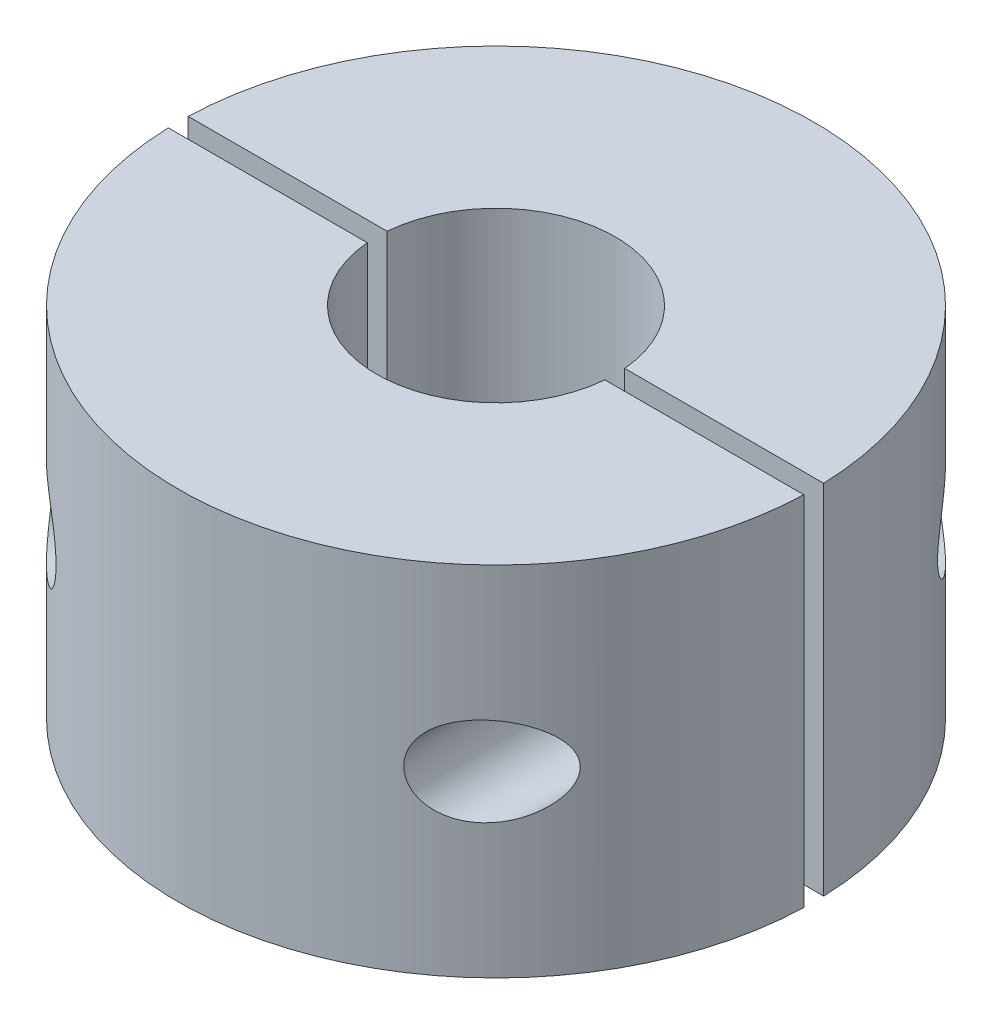
ISO-10303-21;
HEADER;
FILE_DESCRIPTION(('STEP AP214'),'2;1');
FILE_NAME('part.step','',(''),(''),'','','');
FILE_SCHEMA(('AUTOMOTIVE_DESIGN { 1 0 10303 214 1 1 1 1 }'));
ENDSEC;
DATA;
#1=APPLICATION_CONTEXT('core data for automotive mechanical design processes');
#2=APPLICATION_PROTOCOL_DEFINITION('international standard','automotive_design',2000,#1);
#3=PRODUCT_CONTEXT('',#1,'mechanical');
#4=PRODUCT('Part','Part','',(#3));
#5=PRODUCT_RELATED_PRODUCT_CATEGORY('part','',(#4));
#6=PRODUCT_DEFINITION_FORMATION('','',#4);
#7=PRODUCT_DEFINITION_CONTEXT('part definition',#1,'design');
#8=PRODUCT_DEFINITION('design','',#6,#7);
#9=PRODUCT_DEFINITION_SHAPE('','',#8);
#10=(LENGTH_UNIT() NAMED_UNIT(*) SI_UNIT(.MILLI.,.METRE.));
#11=(NAMED_UNIT(*) PLANE_ANGLE_UNIT() SI_UNIT($,.RADIAN.));
#12=(NAMED_UNIT(*) SI_UNIT($,.STERADIAN.) SOLID_ANGLE_UNIT());
#13=UNCERTAINTY_MEASURE_WITH_UNIT(LENGTH_MEASURE(1.E-05),#10,'distance_accuracy_value','');
#14=(GEOMETRIC_REPRESENTATION_CONTEXT(3) GLOBAL_UNCERTAINTY_ASSIGNED_CONTEXT((#13)) GLOBAL_UNIT_ASSIGNED_CONTEXT((#10,
#11,#12)) REPRESENTATION_CONTEXT('',''));
#15=CARTESIAN_POINT('',(0.,0.,0.));
#16=DIRECTION('',(0.,0.,1.));
#17=DIRECTION('',(1.,0.,0.));
#18=AXIS2_PLACEMENT_3D('',#15,#16,#17);
#19=CARTESIAN_POINT('',(0.,9.,0.));
#20=DIRECTION('',(0.,1.,0.));
#21=DIRECTION('',(0.,0.,1.));
#22=AXIS2_PLACEMENT_3D('',#19,#20,#21);
#23=PLANE('',#22);
#24=DIRECTION('',(-1.,0.,0.));
#25=VECTOR('',#24,1.);
#26=CARTESIAN_POINT('',(-10.,9.,-0.25));
#27=LINE('',#26,#25);
#28=CARTESIAN_POINT('',(7.99609279585974,9.,-0.25));
#29=VERTEX_POINT('',#28);
#30=CARTESIAN_POINT('',(2.98956518577535,9.,-0.25));
#31=VERTEX_POINT('',#30);
#32=EDGE_CURVE('E58',#29,#31,#27,.T.);
#33=ORIENTED_EDGE('',*,*,#32,.F.);
#34=CARTESIAN_POINT('',(0.,9.,0.));
#35=DIRECTION('',(0.,1.,0.));
#36=DIRECTION('',(0.,0.,1.));
#37=AXIS2_PLACEMENT_3D('',#34,#35,#36);
#38=CIRCLE('',#37,8.);
#39=CARTESIAN_POINT('',(-7.99609279585974,9.,-0.25));
#40=VERTEX_POINT('',#39);
#41=EDGE_CURVE('E105',#29,#40,#38,.T.);
#42=ORIENTED_EDGE('',*,*,#41,.T.);
#43=CARTESIAN_POINT('',(-2.98956518577535,9.,-0.25));
#44=VERTEX_POINT('',#43);
#45=EDGE_CURVE('E12',#44,#40,#27,.T.);
#46=ORIENTED_EDGE('',*,*,#45,.F.);
#47=CARTESIAN_POINT('',(0.,9.,0.));
#48=DIRECTION('',(0.,1.,0.));
#49=DIRECTION('',(0.,0.,1.));
#50=AXIS2_PLACEMENT_3D('',#47,#48,#49);
#51=CIRCLE('',#50,3.);
#52=EDGE_CURVE('E107',#31,#44,#51,.T.);
#53=ORIENTED_EDGE('',*,*,#52,.F.);
#54=EDGE_LOOP('',(#33,#42,#46,#53));
#55=FACE_BOUND('',#54,.T.);
#56=ADVANCED_FACE('F51',(#55),#23,.T.);
#57=CARTESIAN_POINT('',(0.,9.,0.));
#58=DIRECTION('',(0.,-1.,0.));
#59=DIRECTION('',(0.,0.,-1.));
#60=AXIS2_PLACEMENT_3D('',#57,#58,#59);
#61=CYLINDRICAL_SURFACE('',#60,8.);
#62=CARTESIAN_POINT('',(6.61630374567865,4.5,-4.49716852529663));
#63=CARTESIAN_POINT('',(6.61630097521515,4.53782391919563,-4.49717311494802));
#64=CARTESIAN_POINT('',(6.61436852156714,4.57567931721666,-4.50001970294835));
#65=CARTESIAN_POINT('',(6.60682037375659,4.65022903606621,-4.51109366794627));
#66=CARTESIAN_POINT('',(6.60119869918307,4.68692137009577,-4.51932978157156));
#67=CARTESIAN_POINT('',(6.58499437544165,4.76683776038806,-4.54291719652953));
#68=CARTESIAN_POINT('',(6.57354518247179,4.80951732986716,-4.55950134917317));
#69=CARTESIAN_POINT('',(6.54670795703892,4.8910673075948,-4.59795231204393));
#70=CARTESIAN_POINT('',(6.53131248360755,4.92993032588804,-4.61982909744828));
#71=CARTESIAN_POINT('',(6.48849544272172,5.02332895551232,-4.67989272263247));
#72=CARTESIAN_POINT('',(6.45901892747179,5.07528843767681,-4.72058785129209));
#73=CARTESIAN_POINT('',(6.39489339288196,5.17109188698759,-4.80710537231579));
#74=CARTESIAN_POINT('',(6.36023166318911,5.21491530172674,-4.85294029255453));
#75=CARTESIAN_POINT('',(6.2948016327639,5.28660693817881,-4.93737613242063));
#76=CARTESIAN_POINT('',(6.264806348091,5.31587770799075,-4.9754047292165));
#77=CARTESIAN_POINT('',(6.20265775139858,5.37025503112857,-5.05267280020799));
#78=CARTESIAN_POINT('',(6.17050329207957,5.39535934557557,-5.091912912076));
#79=CARTESIAN_POINT('',(6.07113723556678,5.46474768519955,-5.21074984231699));
#80=CARTESIAN_POINT('',(6.0010278918699,5.5031018752251,-5.2914568275139));
#81=CARTESIAN_POINT('',(5.85215668377745,5.56527374570285,-5.45573029537898));
#82=CARTESIAN_POINT('',(5.77318421100592,5.58856387197283,-5.53930236292581));
#83=CARTESIAN_POINT('',(5.61007570365768,5.61746223842655,-5.70442450286708));
#84=CARTESIAN_POINT('',(5.52594561017759,5.62309044732766,-5.78597675526669));
#85=CARTESIAN_POINT('',(5.37059894409498,5.61534582881109,-5.93007092684596));
#86=CARTESIAN_POINT('',(5.29988493807886,5.60530687655331,-5.99333113137229));
#87=CARTESIAN_POINT('',(5.15832325698283,5.57055122175313,-6.11558630416721));
#88=CARTESIAN_POINT('',(5.08747584350666,5.54585211655333,-6.17458629111488));
#89=CARTESIAN_POINT('',(4.9631949369722,5.48720058944677,-6.27468510392));
#90=CARTESIAN_POINT('',(4.90924622239471,5.45630798435463,-6.3169315769403));
#91=CARTESIAN_POINT('',(4.80499949837298,5.38389852667272,-6.39658210418205));
#92=CARTESIAN_POINT('',(4.75469725822417,5.34239424760963,-6.43399181092906));
#93=CARTESIAN_POINT('',(4.66809618993274,5.25654950823389,-6.49701947632282));
#94=CARTESIAN_POINT('',(4.63086120988678,5.21383744258924,-6.52356345284363));
#95=CARTESIAN_POINT('',(4.56227479964452,5.12141942116801,-6.57171242476261));
#96=CARTESIAN_POINT('',(4.53092176517497,5.07171537891113,-6.5933187672292));
#97=CARTESIAN_POINT('',(4.47562729476319,4.96594447201592,-6.63097985949359));
#98=CARTESIAN_POINT('',(4.45173315220838,4.90983996813812,-6.6469992572077));
#99=CARTESIAN_POINT('',(4.41318246969644,4.79316271494081,-6.67265805842221));
#100=CARTESIAN_POINT('',(4.39852051341103,4.73259260884158,-6.68230120290215));
#101=CARTESIAN_POINT('',(4.38054186530986,4.61615400398879,-6.69409838395601));
#102=CARTESIAN_POINT('',(4.37613283703908,4.56052489792239,-6.69697393016173));
#103=CARTESIAN_POINT('',(4.37565207240494,4.44922568399954,-6.69728830838964));
#104=CARTESIAN_POINT('',(4.37957721173648,4.39355559932613,-6.69472917775843));
#105=CARTESIAN_POINT('',(4.39512435475024,4.28665980798119,-6.68453138047589));
#106=CARTESIAN_POINT('',(4.40635294447542,4.23535088654334,-6.67715226920327));
#107=CARTESIAN_POINT('',(4.43553205661457,4.13560407657751,-6.6578044099746));
#108=CARTESIAN_POINT('',(4.45348287804552,4.08716631587495,-6.64583545785359));
#109=CARTESIAN_POINT('',(4.49599569367427,3.99259370702432,-6.61715190619549));
#110=CARTESIAN_POINT('',(4.52076913995799,3.94660098761111,-6.60028437411968));
#111=CARTESIAN_POINT('',(4.5754955688551,3.8596761399035,-6.56246489606463));
#112=CARTESIAN_POINT('',(4.605450132341,3.81874556273621,-6.54151170321146));
#113=CARTESIAN_POINT('',(4.67285007465819,3.73830055007068,-6.49356258900678));
#114=CARTESIAN_POINT('',(4.71075506185598,3.69941637505107,-6.46615846537668));
#115=CARTESIAN_POINT('',(4.79005863585288,3.62866850458444,-6.40763425835677));
#116=CARTESIAN_POINT('',(4.83145948593837,3.59680940624947,-6.37651176213));
#117=CARTESIAN_POINT('',(4.93517301812667,3.52755454673647,-6.29682322817838));
#118=CARTESIAN_POINT('',(4.9986924676549,3.49386042201211,-6.24659405102497));
#119=CARTESIAN_POINT('',(5.12745093923032,3.43987209892491,-6.14135250483351));
#120=CARTESIAN_POINT('',(5.19269303800287,3.4196038379594,-6.08633110828346));
#121=CARTESIAN_POINT('',(5.341279781097,3.38725051301605,-5.95675806077315));
#122=CARTESIAN_POINT('',(5.42451047498359,3.37911685666996,-5.88109323879956));
#123=CARTESIAN_POINT('',(5.58757807143637,3.38054964182519,-5.72640028723101));
#124=CARTESIAN_POINT('',(5.66741124928088,3.39013502219058,-5.64736864725167));
#125=CARTESIAN_POINT('',(5.82317969282618,3.42558384862202,-5.48664783590383));
#126=CARTESIAN_POINT('',(5.89903241239102,3.45170465156661,-5.40493638139547));
#127=CARTESIAN_POINT('',(6.04411756598144,3.51971037011086,-5.24218382209401));
#128=CARTESIAN_POINT('',(6.11335331921885,3.56158732948467,-5.16114240003394));
#129=CARTESIAN_POINT('',(6.22629776607389,3.64835411163283,-5.02383365159655));
#130=CARTESIAN_POINT('',(6.27189242563188,3.68946744191331,-4.96671931371111));
#131=CARTESIAN_POINT('',(6.35773057807276,3.78138606337663,-4.8563465486794));
#132=CARTESIAN_POINT('',(6.39798332253358,3.83217421718679,-4.80308152982122));
#133=CARTESIAN_POINT('',(6.45842525449343,3.92495419359626,-4.72126682271365));
#134=CARTESIAN_POINT('',(6.48068582265298,3.96373803057657,-4.69062251630029));
#135=CARTESIAN_POINT('',(6.52137757067459,4.04637231182425,-4.63388002101529));
#136=CARTESIAN_POINT('',(6.5398139644689,4.09021572907222,-4.60777565028784));
#137=CARTESIAN_POINT('',(6.5677413049536,4.17164811064316,-4.56784625514427));
#138=CARTESIAN_POINT('',(6.57831729761715,4.20814912457489,-4.55257933617277));
#139=CARTESIAN_POINT('',(6.59589359065684,4.28366198685483,-4.5270774587371));
#140=CARTESIAN_POINT('',(6.60290288837319,4.32266723496683,-4.51682984106194));
#141=CARTESIAN_POINT('',(6.61062136733111,4.38502830316753,-4.50551978635771));
#142=CARTESIAN_POINT('',(6.61274426584411,4.40785249651346,-4.50240157218213));
#143=CARTESIAN_POINT('',(6.61558641594559,4.45378051093975,-4.49822437142407));
#144=CARTESIAN_POINT('',(6.61630543881335,4.4768843769678,-4.49716572038762));
#145=CARTESIAN_POINT('',(6.61630374567865,4.5,-4.49716852529663));
#146=B_SPLINE_CURVE_WITH_KNOTS('',3,(#62,#63,#64,#65,#66,#67,#68,#69,#70,#71,#72,#73,#74,#75,
#76,#77,#78,#79,#80,#81,#82,#83,#84,#85,#86,#87,#88,#89,#90,#91,#92,#93,#94,#95,#96,#97,#98,#99,
#100,#101,#102,#103,#104,#105,#106,#107,#108,#109,#110,#111,#112,#113,#114,#115,#116,#117,#118,
#119,#120,#121,#122,#123,#124,#125,#126,#127,#128,#129,#130,#131,#132,#133,#134,#135,#136,#137,
#138,#139,#140,#141,#142,#143,#144,#145),.UNSPECIFIED.,.T.,.F.,(4,2,2,2,2,2,2,2,2,2,2,2,2,2,2,2,
2,2,2,2,2,2,2,2,2,2,2,2,2,2,2,2,2,2,2,2,2,2,2,2,2,4),(0.,0.113378381222465,0.226941009962329,
0.367744537670631,0.508815538038643,0.724465752907708,0.940653519320559,1.11020684668784,
1.27985099197843,1.61916788043702,1.9698030354337,2.32004161618233,2.60525189761512,
2.89012051672791,3.11476988198876,3.33915428910909,3.52610360837456,3.71300186371688,
3.90106215296602,4.08901200817337,4.25578106223599,4.42248760910704,4.58088442801839,
4.73928829354252,4.90329704047604,5.06735591863964,5.24913160293192,5.4310258879905,
5.69270942170459,5.95489703820243,6.29144769495257,6.62835827944537,6.97064596853942,
7.31276104756973,7.56371098625896,7.81422047333256,7.97644441190394,8.13844569681531,
8.26087830472973,8.38300051386456,8.45227903116554,8.52156883444541),.UNSPECIFIED.);
#147=CARTESIAN_POINT('',(6.61630374567865,4.5,-4.49716852529663));
#148=VERTEX_POINT('',#147);
#149=EDGE_CURVE('E112',#148,#148,#146,.T.);
#150=ORIENTED_EDGE('',*,*,#149,.T.);
#151=EDGE_LOOP('',(#150));
#152=FACE_BOUND('',#151,.T.);
#153=CARTESIAN_POINT('',(-4.37588184604082,4.5,-6.69713805065196));
#154=CARTESIAN_POINT('',(-4.37588540274114,4.55489865444353,-6.69713640384349));
#155=CARTESIAN_POINT('',(-4.37994362824029,4.60985732533954,-6.69448953461557));
#156=CARTESIAN_POINT('',(-4.39596122363341,4.71815182009639,-6.68398175380238));
#157=CARTESIAN_POINT('',(-4.40793403758684,4.77148472081574,-6.67611197026051));
#158=CARTESIAN_POINT('',(-4.43906754417726,4.87479377051065,-6.65545069275329));
#159=CARTESIAN_POINT('',(-4.4582045136044,4.92478036336938,-6.64267543909323));
#160=CARTESIAN_POINT('',(-4.50269218087337,5.02039459584808,-6.61260013073753));
#161=CARTESIAN_POINT('',(-4.52804194697402,5.06602288766344,-6.59530075450436));
#162=CARTESIAN_POINT('',(-4.58515834927202,5.15418632857773,-6.55572896021696));
#163=CARTESIAN_POINT('',(-4.6171729520296,5.19647093556377,-6.53325905481346));
#164=CARTESIAN_POINT('',(-4.68546428543694,5.27489463769482,-6.4844573513601));
#165=CARTESIAN_POINT('',(-4.72174256314853,5.31103149043259,-6.45812415065911));
#166=CARTESIAN_POINT('',(-4.8028551788388,5.38181507004109,-6.39808378041073));
#167=CARTESIAN_POINT('',(-4.84816577293665,5.41547619242649,-6.3638612719633));
#168=CARTESIAN_POINT('',(-4.94120618754586,5.47469037871597,-6.29189617850907));
#169=CARTESIAN_POINT('',(-4.98893795709536,5.50023678621028,-6.25415073634455));
#170=CARTESIAN_POINT('',(-5.10944584703947,5.55434140900979,-6.1564719059818));
#171=CARTESIAN_POINT('',(-5.18294869687701,5.5781563207987,-6.09478680859867));
#172=CARTESIAN_POINT('',(-5.3295264639779,5.61030621026674,-5.96704830035875));
#173=CARTESIAN_POINT('',(-5.40260042532665,5.61861443671343,-5.90098754372603));
#174=CARTESIAN_POINT('',(-5.56400769083686,5.62173122394994,-5.74950937271551));
#175=CARTESIAN_POINT('',(-5.65168490601406,5.61272652230695,-5.66332017425387));
#176=CARTESIAN_POINT('',(-5.82117625186078,5.57552423975362,-5.48896465816021));
#177=CARTESIAN_POINT('',(-5.90297514457224,5.54727863489269,-5.40079392849901));
#178=CARTESIAN_POINT('',(-6.02021949885343,5.49099212359543,-5.26882339666668));
#179=CARTESIAN_POINT('',(-6.05859868978498,5.46974544447216,-5.2246248978576));
#180=CARTESIAN_POINT('',(-6.13313701940276,5.42249391768088,-5.1369184432178));
#181=CARTESIAN_POINT('',(-6.16929733324916,5.39649161824186,-5.09341013106454));
#182=CARTESIAN_POINT('',(-6.23899305902956,5.3396355379451,-5.0077942312491));
#183=CARTESIAN_POINT('',(-6.27253758085029,5.30879983434656,-4.96568210565518));
#184=CARTESIAN_POINT('',(-6.33671405519582,5.24187347164387,-4.88351954739759));
#185=CARTESIAN_POINT('',(-6.36734958791844,5.20578941414644,-4.84346660902063));
#186=CARTESIAN_POINT('',(-6.42118908944802,5.13310916497755,-4.77179836151869));
#187=CARTESIAN_POINT('',(-6.44483721375078,5.0972489120812,-4.73977608736663));
#188=CARTESIAN_POINT('',(-6.48887291076703,5.02077290346216,-4.67930786080151));
#189=CARTESIAN_POINT('',(-6.509262842742,4.98016062593892,-4.65085932386201));
#190=CARTESIAN_POINT('',(-6.54299293697504,4.90055136417754,-4.60325552424695));
#191=CARTESIAN_POINT('',(-6.55693536300559,4.86227116283957,-4.58334366837382));
#192=CARTESIAN_POINT('',(-6.58095963992965,4.78226079199409,-4.54878176233439));
#193=CARTESIAN_POINT('',(-6.59104817847986,4.74053675304836,-4.53412259992819));
#194=CARTESIAN_POINT('',(-6.60498590146722,4.66271606498623,-4.51378824263648));
#195=CARTESIAN_POINT('',(-6.60966217717089,4.62708165530218,-4.50692704754556));
#196=CARTESIAN_POINT('',(-6.61554030462514,4.55492346104333,-4.4982947354964));
#197=CARTESIAN_POINT('',(-6.61674487716911,4.51840039556484,-4.49651963254537));
#198=CARTESIAN_POINT('',(-6.61557215421069,4.4455243768649,-4.4982447323843));
#199=CARTESIAN_POINT('',(-6.6131932152054,4.40917150937262,-4.50174735569363));
#200=CARTESIAN_POINT('',(-6.60506524624084,4.33766871149197,-4.51366407538296));
#201=CARTESIAN_POINT('',(-6.59931327574887,4.3025198590697,-4.52208245718308));
#202=CARTESIAN_POINT('',(-6.58267623277682,4.22381311019062,-4.54627824214939));
#203=CARTESIAN_POINT('',(-6.57076518493605,4.18092434927439,-4.56351080236572));
#204=CARTESIAN_POINT('',(-6.54299100626501,4.0990558462874,-4.60324427032989));
#205=CARTESIAN_POINT('',(-6.52711940005082,4.06008474198087,-4.62575646992712));
#206=CARTESIAN_POINT('',(-6.48290333396693,3.96610066558259,-4.68765080833025));
#207=CARTESIAN_POINT('',(-6.4524499055593,3.91377907615366,-4.72958100792943));
#208=CARTESIAN_POINT('',(-6.38629490263116,3.8174776939273,-4.81854089439414));
#209=CARTESIAN_POINT('',(-6.35058050901784,3.77351889538229,-4.86558296145511));
#210=CARTESIAN_POINT('',(-6.28339405776166,3.7019578784803,-4.95189466428925));
#211=CARTESIAN_POINT('',(-6.25272369117045,3.67288650198107,-4.9905901536659));
#212=CARTESIAN_POINT('',(-6.18920957773101,3.61897943946364,-5.06914625145215));
#213=CARTESIAN_POINT('',(-6.1563646990236,3.59414598377725,-5.1090074605099));
#214=CARTESIAN_POINT('',(-6.05490165199702,3.52569175090594,-5.22964281736421));
#215=CARTESIAN_POINT('',(-5.98335822236871,3.48812035880069,-5.31146460902395));
#216=CARTESIAN_POINT('',(-5.83172301361065,3.42805171089226,-5.47759787187906));
#217=CARTESIAN_POINT('',(-5.75143625952487,3.40605251457491,-5.56190867855178));
#218=CARTESIAN_POINT('',(-5.58576367690961,3.38025025307501,-5.72825951100396));
#219=CARTESIAN_POINT('',(-5.5003843546409,3.37642445324569,-5.81030224623277));
#220=CARTESIAN_POINT('',(-5.34476837956336,3.38791149808873,-5.95333810734408));
#221=CARTESIAN_POINT('',(-5.27503789318001,3.39944203132207,-6.01518435954323));
#222=CARTESIAN_POINT('',(-5.13570375309596,3.436900587728,-6.13456701597106));
#223=CARTESIAN_POINT('',(-5.06610004840765,3.46281104167367,-6.19210858245098));
#224=CARTESIAN_POINT('',(-4.94402582130953,3.52341181612351,-6.28978612760247));
#225=CARTESIAN_POINT('',(-4.89100232903025,3.55515593175438,-6.33105332311595));
#226=CARTESIAN_POINT('',(-4.78877026202741,3.62906257417371,-6.40872699796531));
#227=CARTESIAN_POINT('',(-4.73955713861057,3.67121241895599,-6.44513931161738));
#228=CARTESIAN_POINT('',(-4.65495451114362,3.75810448597786,-6.5064332929472));
#229=CARTESIAN_POINT('',(-4.61862236857112,3.80128227443053,-6.53222649555959));
#230=CARTESIAN_POINT('',(-4.55191665495163,3.89445775616961,-6.57888383193869));
#231=CARTESIAN_POINT('',(-4.52154371406553,3.94445616976214,-6.59974744446928));
#232=CARTESIAN_POINT('',(-4.46824610936001,4.05060520035217,-6.63594970648273));
#233=CARTESIAN_POINT('',(-4.44537326510242,4.10679517803782,-6.65124999377066));
#234=CARTESIAN_POINT('',(-4.40888106298378,4.22332402467442,-6.67549680512294));
#235=CARTESIAN_POINT('',(-4.39523913033059,4.28365237169542,-6.68445883225886));
#236=CARTESIAN_POINT('',(-4.3830858214549,4.37052869051416,-6.69242647107371));
#237=CARTESIAN_POINT('',(-4.38038908997252,4.39631301268072,-6.69419120343679));
#238=CARTESIAN_POINT('',(-4.37678628740617,4.44806041439041,-6.69654736540442));
#239=CARTESIAN_POINT('',(-4.37588016310947,4.47402348859844,-6.69713882987578));
#240=CARTESIAN_POINT('',(-4.37588184604082,4.5,-6.69713805065196));
#241=B_SPLINE_CURVE_WITH_KNOTS('',3,(#153,#154,#155,#156,#157,#158,#159,#160,#161,#162,#163,
#164,#165,#166,#167,#168,#169,#170,#171,#172,#173,#174,#175,#176,#177,#178,#179,#180,#181,#182,
#183,#184,#185,#186,#187,#188,#189,#190,#191,#192,#193,#194,#195,#196,#197,#198,#199,#200,#201,
#202,#203,#204,#205,#206,#207,#208,#209,#210,#211,#212,#213,#214,#215,#216,#217,#218,#219,#220,
#221,#222,#223,#224,#225,#226,#227,#228,#229,#230,#231,#232,#233,#234,#235,#236,#237,#238,#239,
#240),.UNSPECIFIED.,.T.,.F.,(4,2,2,2,2,2,2,2,2,2,2,2,2,2,2,2,2,2,2,2,2,2,2,2,2,2,2,2,2,2,2,2,2,
2,2,2,2,2,2,2,2,2,2,4),(0.,0.164591321757181,0.329462946296776,0.49379337988035,
0.658099183679989,0.830224303469309,1.00241207229835,1.19970710725837,1.39716356567715,
1.69213591420006,1.98761666320206,2.35561029507436,2.72452579505806,2.91116502731434,
3.09770454314324,3.28356234106061,3.46918834894817,3.62958939878033,3.78987377046482,
3.92543939772885,4.06076869740281,4.17005520604575,4.27925604291355,4.38850697772045,
4.49785329691399,4.64024735624335,4.78294878438632,5.00265426055451,5.22290421799283,
5.39457598265146,5.56633781790676,5.90987956935318,6.2639655391688,6.61760843587851,
6.89835856185171,7.17876642320174,7.40086374773094,7.62269171547695,7.80806400525457,
7.99345588683081,8.18010293386235,8.36629185757817,8.44417419282884,8.52205421356088),.UNSPECIFIED.);
#242=CARTESIAN_POINT('',(-4.37588184604082,4.5,-6.69713805065196));
#243=VERTEX_POINT('',#242);
#244=EDGE_CURVE('E124',#243,#243,#241,.T.);
#245=ORIENTED_EDGE('',*,*,#244,.T.);
#246=EDGE_LOOP('',(#245));
#247=FACE_BOUND('',#246,.T.);
#248=ORIENTED_EDGE('',*,*,#41,.F.);
#249=DIRECTION('',(0.,-1.,0.));
#250=VECTOR('',#249,1.);
#251=CARTESIAN_POINT('',(7.99609279585974,9.,-0.25));
#252=LINE('',#251,#250);
#253=CARTESIAN_POINT('',(7.99609279585974,0.,-0.25));
#254=VERTEX_POINT('',#253);
#255=EDGE_CURVE('E93',#29,#254,#252,.T.);
#256=ORIENTED_EDGE('',*,*,#255,.T.);
#257=CARTESIAN_POINT('',(0.,0.,0.));
#258=DIRECTION('',(0.,1.,0.));
#259=DIRECTION('',(0.,0.,1.));
#260=AXIS2_PLACEMENT_3D('',#257,#258,#259);
#261=CIRCLE('',#260,8.);
#262=CARTESIAN_POINT('',(-7.99609279585974,0.,-0.25));
#263=VERTEX_POINT('',#262);
#264=EDGE_CURVE('E101',#254,#263,#261,.T.);
#265=ORIENTED_EDGE('',*,*,#264,.T.);
#266=DIRECTION('',(0.,-1.,0.));
#267=VECTOR('',#266,1.);
#268=CARTESIAN_POINT('',(-7.99609279585974,9.,-0.25));
#269=LINE('',#268,#267);
#270=EDGE_CURVE('E69',#263,#40,#269,.F.);
#271=ORIENTED_EDGE('',*,*,#270,.T.);
#272=EDGE_LOOP('',(#248,#256,#265,#271));
#273=FACE_BOUND('',#272,.T.);
#274=ADVANCED_FACE('F109',(#152,#247,#273),#61,.T.);
#275=CARTESIAN_POINT('',(0.,0.,0.));
#276=DIRECTION('',(0.,1.,0.));
#277=DIRECTION('',(0.,0.,1.));
#278=AXIS2_PLACEMENT_3D('',#275,#276,#277);
#279=PLANE('',#278);
#280=ORIENTED_EDGE('',*,*,#264,.F.);
#281=DIRECTION('',(-1.,0.,0.));
#282=VECTOR('',#281,1.);
#283=CARTESIAN_POINT('',(-10.,0.,-0.25));
#284=LINE('',#283,#282);
#285=CARTESIAN_POINT('',(2.98956518577535,0.,-0.25));
#286=VERTEX_POINT('',#285);
#287=EDGE_CURVE('E96',#254,#286,#284,.T.);
#288=ORIENTED_EDGE('',*,*,#287,.T.);
#289=CARTESIAN_POINT('',(0.,0.,0.));
#290=DIRECTION('',(0.,1.,0.));
#291=DIRECTION('',(0.,0.,1.));
#292=AXIS2_PLACEMENT_3D('',#289,#290,#291);
#293=CIRCLE('',#292,3.);
#294=CARTESIAN_POINT('',(-2.98956518577535,0.,-0.25));
#295=VERTEX_POINT('',#294);
#296=EDGE_CURVE('E116',#286,#295,#293,.T.);
#297=ORIENTED_EDGE('',*,*,#296,.T.);
#298=EDGE_CURVE('E88',#295,#263,#284,.T.);
#299=ORIENTED_EDGE('',*,*,#298,.T.);
#300=EDGE_LOOP('',(#280,#288,#297,#299));
#301=FACE_BOUND('',#300,.T.);
#302=ADVANCED_FACE('F154',(#301),#279,.F.);
#303=CARTESIAN_POINT('',(0.,0.,0.));
#304=DIRECTION('',(0.,1.,0.));
#305=DIRECTION('',(0.,0.,1.));
#306=AXIS2_PLACEMENT_3D('',#303,#304,#305);
#307=CYLINDRICAL_SURFACE('',#306,3.);
#308=ORIENTED_EDGE('',*,*,#52,.T.);
#309=DIRECTION('',(0.,1.,0.));
#310=VECTOR('',#309,1.);
#311=CARTESIAN_POINT('',(-2.98956518577535,0.,-0.25));
#312=LINE('',#311,#310);
#313=EDGE_CURVE('E83',#44,#295,#312,.F.);
#314=ORIENTED_EDGE('',*,*,#313,.T.);
#315=ORIENTED_EDGE('',*,*,#296,.F.);
#316=DIRECTION('',(0.,1.,0.));
#317=VECTOR('',#316,1.);
#318=CARTESIAN_POINT('',(2.98956518577535,0.,-0.25));
#319=LINE('',#318,#317);
#320=EDGE_CURVE('E108',#286,#31,#319,.T.);
#321=ORIENTED_EDGE('',*,*,#320,.T.);
#322=EDGE_LOOP('',(#308,#314,#315,#321));
#323=FACE_BOUND('',#322,.T.);
#324=ADVANCED_FACE('F155',(#323),#307,.F.);
#325=CARTESIAN_POINT('',(-10.,0.,-0.25));
#326=DIRECTION('',(0.,0.,-1.));
#327=DIRECTION('',(-1.,0.,0.));
#328=AXIS2_PLACEMENT_3D('',#325,#326,#327);
#329=PLANE('',#328);
#330=CARTESIAN_POINT('',(5.49609279585974,4.5,-0.25));
#331=DIRECTION('',(0.,0.,-1.));
#332=DIRECTION('',(-1.,0.,0.));
#333=AXIS2_PLACEMENT_3D('',#330,#331,#332);
#334=CIRCLE('',#333,1.12021094981892);
#335=CARTESIAN_POINT('',(4.37588184604082,4.5,-0.25));
#336=VERTEX_POINT('',#335);
#337=EDGE_CURVE('E53',#336,#336,#334,.T.);
#338=ORIENTED_EDGE('',*,*,#337,.T.);
#339=EDGE_LOOP('',(#338));
#340=FACE_BOUND('',#339,.T.);
#341=ORIENTED_EDGE('',*,*,#32,.T.);
#342=ORIENTED_EDGE('',*,*,#320,.F.);
#343=ORIENTED_EDGE('',*,*,#287,.F.);
#344=ORIENTED_EDGE('',*,*,#255,.F.);
#345=EDGE_LOOP('',(#341,#342,#343,#344));
#346=FACE_BOUND('',#345,.T.);
#347=ADVANCED_FACE('F91',(#340,#346),#329,.F.);
#348=CARTESIAN_POINT('',(-5.49609279585974,4.5,-0.25));
#349=DIRECTION('',(0.,0.,-1.));
#350=DIRECTION('',(-1.,0.,0.));
#351=AXIS2_PLACEMENT_3D('',#348,#349,#350);
#352=CIRCLE('',#351,1.12021094981892);
#353=CARTESIAN_POINT('',(-6.61630374567865,4.5,-0.25));
#354=VERTEX_POINT('',#353);
#355=EDGE_CURVE('E121',#354,#354,#352,.T.);
#356=ORIENTED_EDGE('',*,*,#355,.T.);
#357=EDGE_LOOP('',(#356));
#358=FACE_BOUND('',#357,.T.);
#359=ORIENTED_EDGE('',*,*,#298,.F.);
#360=ORIENTED_EDGE('',*,*,#313,.F.);
#361=ORIENTED_EDGE('',*,*,#45,.T.);
#362=ORIENTED_EDGE('',*,*,#270,.F.);
#363=EDGE_LOOP('',(#359,#360,#361,#362));
#364=FACE_BOUND('',#363,.T.);
#365=ADVANCED_FACE('F146',(#358,#364),#329,.F.);
#366=CARTESIAN_POINT('',(-5.49609279585974,4.5,-8.));
#367=DIRECTION('',(0.,0.,1.));
#368=DIRECTION('',(1.,0.,0.));
#369=AXIS2_PLACEMENT_3D('',#366,#367,#368);
#370=CYLINDRICAL_SURFACE('',#369,1.12021094981892);
#371=ORIENTED_EDGE('',*,*,#355,.F.);
#372=EDGE_LOOP('',(#371));
#373=FACE_BOUND('',#372,.T.);
#374=ORIENTED_EDGE('',*,*,#244,.F.);
#375=EDGE_LOOP('',(#374));
#376=FACE_BOUND('',#375,.T.);
#377=ADVANCED_FACE('F141',(#373,#376),#370,.F.);
#378=CARTESIAN_POINT('',(5.49609279585974,4.5,-8.));
#379=DIRECTION('',(0.,0.,1.));
#380=DIRECTION('',(1.,0.,0.));
#381=AXIS2_PLACEMENT_3D('',#378,#379,#380);
#382=CYLINDRICAL_SURFACE('',#381,1.12021094981892);
#383=ORIENTED_EDGE('',*,*,#337,.F.);
#384=EDGE_LOOP('',(#383));
#385=FACE_BOUND('',#384,.T.);
#386=ORIENTED_EDGE('',*,*,#149,.F.);
#387=EDGE_LOOP('',(#386));
#388=FACE_BOUND('',#387,.T.);
#389=ADVANCED_FACE('F150',(#385,#388),#382,.F.);
#390=CLOSED_SHELL('',(#56,#274,#302,#324,#347,#365,#377,#389));
#391=MANIFOLD_SOLID_BREP('B2',#390);
#392=CARTESIAN_POINT('',(0.,0.,0.));
#393=DIRECTION('',(0.,1.,0.));
#394=DIRECTION('',(0.,0.,1.));
#395=AXIS2_PLACEMENT_3D('',#392,#393,#394);
#396=CYLINDRICAL_SURFACE('',#395,3.);
#397=CARTESIAN_POINT('',(0.,9.,0.));
#398=DIRECTION('',(0.,1.,0.));
#399=DIRECTION('',(0.,0.,1.));
#400=AXIS2_PLACEMENT_3D('',#397,#398,#399);
#401=CIRCLE('',#400,3.);
#402=CARTESIAN_POINT('',(-2.98956518577535,9.,0.25));
#403=VERTEX_POINT('',#402);
#404=CARTESIAN_POINT('',(2.98956518577535,9.,0.25));
#405=VERTEX_POINT('',#404);
#406=EDGE_CURVE('E272',#403,#405,#401,.T.);
#407=ORIENTED_EDGE('',*,*,#406,.T.);
#408=DIRECTION('',(0.,1.,0.));
#409=VECTOR('',#408,1.);
#410=CARTESIAN_POINT('',(2.98956518577535,0.,0.25));
#411=LINE('',#410,#409);
#412=CARTESIAN_POINT('',(2.98956518577535,0.,0.25));
#413=VERTEX_POINT('',#412);
#414=EDGE_CURVE('E47',#405,#413,#411,.F.);
#415=ORIENTED_EDGE('',*,*,#414,.T.);
#416=CARTESIAN_POINT('',(0.,0.,0.));
#417=DIRECTION('',(0.,1.,0.));
#418=DIRECTION('',(0.,0.,1.));
#419=AXIS2_PLACEMENT_3D('',#416,#417,#418);
#420=CIRCLE('',#419,3.);
#421=CARTESIAN_POINT('',(-2.98956518577535,0.,0.25));
#422=VERTEX_POINT('',#421);
#423=EDGE_CURVE('E288',#422,#413,#420,.T.);
#424=ORIENTED_EDGE('',*,*,#423,.F.);
#425=DIRECTION('',(0.,1.,0.));
#426=VECTOR('',#425,1.);
#427=CARTESIAN_POINT('',(-2.98956518577535,0.,0.25));
#428=LINE('',#427,#426);
#429=EDGE_CURVE('E233',#422,#403,#428,.T.);
#430=ORIENTED_EDGE('',*,*,#429,.T.);
#431=EDGE_LOOP('',(#407,#415,#424,#430));
#432=FACE_BOUND('',#431,.T.);
#433=ADVANCED_FACE('F221',(#432),#396,.F.);
#434=CARTESIAN_POINT('',(0.,9.,0.));
#435=DIRECTION('',(0.,-1.,0.));
#436=DIRECTION('',(0.,0.,-1.));
#437=AXIS2_PLACEMENT_3D('',#434,#435,#436);
#438=CYLINDRICAL_SURFACE('',#437,8.);
#439=CARTESIAN_POINT('',(6.61630374567865,4.5,4.49716852529663));
#440=CARTESIAN_POINT('',(6.61630097521515,4.46217608080437,4.49717311494802));
#441=CARTESIAN_POINT('',(6.61436852156714,4.42432068278334,4.50001970294835));
#442=CARTESIAN_POINT('',(6.60682037375659,4.34977096393379,4.51109366794627));
#443=CARTESIAN_POINT('',(6.60119869918307,4.31307862990423,4.51932978157156));
#444=CARTESIAN_POINT('',(6.58499437544165,4.23316223961194,4.54291719652953));
#445=CARTESIAN_POINT('',(6.57354518247179,4.19048267013284,4.55950134917317));
#446=CARTESIAN_POINT('',(6.54670795703892,4.10893269240519,4.59795231204393));
#447=CARTESIAN_POINT('',(6.53131248360755,4.07006967411196,4.61982909744828));
#448=CARTESIAN_POINT('',(6.48849544272172,3.97667104448768,4.67989272263247));
#449=CARTESIAN_POINT('',(6.45901892747179,3.92471156232319,4.72058785129209));
#450=CARTESIAN_POINT('',(6.39489339288196,3.82890811301241,4.80710537231579));
#451=CARTESIAN_POINT('',(6.36023166318911,3.78508469827326,4.85294029255453));
#452=CARTESIAN_POINT('',(6.2948016327639,3.71339306182119,4.93737613242063));
#453=CARTESIAN_POINT('',(6.264806348091,3.68412229200925,4.9754047292165));
#454=CARTESIAN_POINT('',(6.20265775139858,3.62974496887143,5.05267280020799));
#455=CARTESIAN_POINT('',(6.17050329207957,3.60464065442443,5.091912912076));
#456=CARTESIAN_POINT('',(6.07113723556678,3.53525231480045,5.21074984231699));
#457=CARTESIAN_POINT('',(6.0010278918699,3.4968981247749,5.2914568275139));
#458=CARTESIAN_POINT('',(5.85215668377745,3.43472625429715,5.45573029537899));
#459=CARTESIAN_POINT('',(5.77318421100592,3.41143612802717,5.53930236292581));
#460=CARTESIAN_POINT('',(5.61007570365767,3.38253776157345,5.70442450286708));
#461=CARTESIAN_POINT('',(5.52594561017758,3.37690955267234,5.78597675526669));
#462=CARTESIAN_POINT('',(5.37059894409497,3.38465417118891,5.93007092684596));
#463=CARTESIAN_POINT('',(5.29988493807886,3.39469312344669,5.99333113137229));
#464=CARTESIAN_POINT('',(5.15832325698283,3.42944877824687,6.11558630416721));
#465=CARTESIAN_POINT('',(5.08747584350666,3.45414788344667,6.17458629111488));
#466=CARTESIAN_POINT('',(4.96319493697219,3.51279941055323,6.27468510392));
#467=CARTESIAN_POINT('',(4.90924622239471,3.54369201564537,6.3169315769403));
#468=CARTESIAN_POINT('',(4.80499949837298,3.61610147332728,6.39658210418205));
#469=CARTESIAN_POINT('',(4.75469725822417,3.65760575239037,6.43399181092906));
#470=CARTESIAN_POINT('',(4.66809618993273,3.74345049176612,6.49701947632282));
#471=CARTESIAN_POINT('',(4.63086120988677,3.78616255741076,6.52356345284363));
#472=CARTESIAN_POINT('',(4.56227479964452,3.878580578832,6.57171242476261));
#473=CARTESIAN_POINT('',(4.53092176517496,3.92828462108888,6.5933187672292));
#474=CARTESIAN_POINT('',(4.47562729476318,4.03405552798408,6.63097985949359));
#475=CARTESIAN_POINT('',(4.45173315220838,4.09016003186188,6.6469992572077));
#476=CARTESIAN_POINT('',(4.41318246969644,4.2068372850592,6.67265805842221));
#477=CARTESIAN_POINT('',(4.39852051341103,4.26740739115842,6.68230120290215));
#478=CARTESIAN_POINT('',(4.38054186530986,4.38384599601121,6.69409838395601));
#479=CARTESIAN_POINT('',(4.37613283703908,4.43947510207761,6.69697393016173));
#480=CARTESIAN_POINT('',(4.37565207240494,4.55077431600046,6.69728830838964));
#481=CARTESIAN_POINT('',(4.37957721173648,4.60644440067387,6.69472917775843));
#482=CARTESIAN_POINT('',(4.39512435475025,4.71334019201881,6.68453138047589));
#483=CARTESIAN_POINT('',(4.40635294447542,4.76464911345666,6.67715226920327));
#484=CARTESIAN_POINT('',(4.43553205661457,4.86439592342249,6.6578044099746));
#485=CARTESIAN_POINT('',(4.45348287804552,4.91283368412505,6.64583545785359));
#486=CARTESIAN_POINT('',(4.49599569367427,5.00740629297568,6.61715190619549));
#487=CARTESIAN_POINT('',(4.52076913995799,5.05339901238889,6.60028437411968));
#488=CARTESIAN_POINT('',(4.5754955688551,5.1403238600965,6.56246489606463));
#489=CARTESIAN_POINT('',(4.60545013234101,5.18125443726379,6.54151170321146));
#490=CARTESIAN_POINT('',(4.67285007465819,5.26169944992932,6.49356258900678));
#491=CARTESIAN_POINT('',(4.71075506185599,5.30058362494893,6.46615846537668));
#492=CARTESIAN_POINT('',(4.79005863585289,5.37133149541556,6.40763425835677));
#493=CARTESIAN_POINT('',(4.83145948593837,5.40319059375053,6.37651176213));
#494=CARTESIAN_POINT('',(4.93517301812667,5.47244545326353,6.29682322817838));
#495=CARTESIAN_POINT('',(4.9986924676549,5.50613957798789,6.24659405102497));
#496=CARTESIAN_POINT('',(5.12745093923032,5.56012790107509,6.1413525048335));
#497=CARTESIAN_POINT('',(5.19269303800287,5.5803961620406,6.08633110828345));
#498=CARTESIAN_POINT('',(5.34127978109701,5.61274948698395,5.95675806077315));
#499=CARTESIAN_POINT('',(5.4245104749836,5.62088314333004,5.88109323879956));
#500=CARTESIAN_POINT('',(5.58757807143637,5.61945035817481,5.726400287231));
#501=CARTESIAN_POINT('',(5.66741124928088,5.60986497780942,5.64736864725166));
#502=CARTESIAN_POINT('',(5.82317969282618,5.57441615137797,5.48664783590382));
#503=CARTESIAN_POINT('',(5.89903241239103,5.54829534843339,5.40493638139546));
#504=CARTESIAN_POINT('',(6.04411756598144,5.48028962988914,5.242183822094));
#505=CARTESIAN_POINT('',(6.11335331921885,5.43841267051532,5.16114240003393));
#506=CARTESIAN_POINT('',(6.2262977660739,5.35164588836716,5.02383365159655));
#507=CARTESIAN_POINT('',(6.27189242563188,5.31053255808669,4.9667193137111));
#508=CARTESIAN_POINT('',(6.35773057807276,5.21861393662336,4.85634654867939));
#509=CARTESIAN_POINT('',(6.39798332253359,5.16782578281321,4.80308152982122));
#510=CARTESIAN_POINT('',(6.45842525449343,5.07504580640374,4.72126682271365));
#511=CARTESIAN_POINT('',(6.48068582265298,5.03626196942343,4.69062251630029));
#512=CARTESIAN_POINT('',(6.52137757067459,4.95362768817575,4.63388002101528));
#513=CARTESIAN_POINT('',(6.53981396446891,4.90978427092777,4.60777565028784));
#514=CARTESIAN_POINT('',(6.5677413049536,4.82835188935683,4.56784625514427));
#515=CARTESIAN_POINT('',(6.57831729761715,4.79185087542511,4.55257933617276));
#516=CARTESIAN_POINT('',(6.59589359065684,4.71633801314517,4.52707745873709));
#517=CARTESIAN_POINT('',(6.6029028883732,4.67733276503316,4.51682984106194));
#518=CARTESIAN_POINT('',(6.61062136733111,4.61497169683246,4.50551978635771));
#519=CARTESIAN_POINT('',(6.61274426584411,4.59214750348654,4.50240157218213));
#520=CARTESIAN_POINT('',(6.61558641594559,4.54621948906025,4.49822437142407));
#521=CARTESIAN_POINT('',(6.61630543881335,4.5231156230322,4.49716572038762));
#522=CARTESIAN_POINT('',(6.61630374567865,4.5,4.49716852529663));
#523=B_SPLINE_CURVE_WITH_KNOTS('',3,(#439,#440,#441,#442,#443,#444,#445,#446,#447,#448,#449,
#450,#451,#452,#453,#454,#455,#456,#457,#458,#459,#460,#461,#462,#463,#464,#465,#466,#467,#468,
#469,#470,#471,#472,#473,#474,#475,#476,#477,#478,#479,#480,#481,#482,#483,#484,#485,#486,#487,
#488,#489,#490,#491,#492,#493,#494,#495,#496,#497,#498,#499,#500,#501,#502,#503,#504,#505,#506,
#507,#508,#509,#510,#511,#512,#513,#514,#515,#516,#517,#518,#519,#520,#521,#522),.UNSPECIFIED.,
.T.,.F.,(4,2,2,2,2,2,2,2,2,2,2,2,2,2,2,2,2,2,2,2,2,2,2,2,2,2,2,2,2,2,2,2,2,2,2,2,2,2,2,2,2,4),
(0.,0.113378381222465,0.226941009962329,0.367744537670631,0.508815538038643,0.724465752907708,
0.940653519320559,1.11020684668784,1.27985099197843,1.61916788043702,1.96980303543371,
2.32004161618233,2.60525189761512,2.89012051672791,3.11476988198876,3.33915428910909,
3.52610360837456,3.71300186371688,3.90106215296602,4.08901200817337,4.25578106223599,
4.42248760910704,4.5808844280184,4.73928829354252,4.90329704047604,5.06735591863964,
5.24913160293193,5.43102588799051,5.6927094217046,5.95489703820244,6.29144769495258,
6.62835827944537,6.97064596853943,7.31276104756974,7.56371098625897,7.81422047333256,
7.97644441190394,8.13844569681532,8.26087830472974,8.38300051386457,8.45227903116554,
8.52156883444541),.UNSPECIFIED.);
#524=CARTESIAN_POINT('',(6.61630374567865,4.5,4.49716852529663));
#525=VERTEX_POINT('',#524);
#526=EDGE_CURVE('E293',#525,#525,#523,.T.);
#527=ORIENTED_EDGE('',*,*,#526,.T.);
#528=EDGE_LOOP('',(#527));
#529=FACE_BOUND('',#528,.T.);
#530=CARTESIAN_POINT('',(-4.37588184604082,4.5,6.69713805065196));
#531=CARTESIAN_POINT('',(-4.37588540274114,4.44510134555647,6.69713640384349));
#532=CARTESIAN_POINT('',(-4.37994362824029,4.39014267466046,6.69448953461557));
#533=CARTESIAN_POINT('',(-4.39596122363341,4.28184817990361,6.68398175380238));
#534=CARTESIAN_POINT('',(-4.40793403758684,4.22851527918426,6.67611197026051));
#535=CARTESIAN_POINT('',(-4.43906754417726,4.12520622948935,6.65545069275329));
#536=CARTESIAN_POINT('',(-4.4582045136044,4.07521963663061,6.64267543909323));
#537=CARTESIAN_POINT('',(-4.50269218087337,3.97960540415191,6.61260013073753));
#538=CARTESIAN_POINT('',(-4.52804194697402,3.93397711233656,6.59530075450436));
#539=CARTESIAN_POINT('',(-4.58515834927202,3.84581367142227,6.55572896021696));
#540=CARTESIAN_POINT('',(-4.6171729520296,3.80352906443623,6.53325905481346));
#541=CARTESIAN_POINT('',(-4.68546428543694,3.72510536230518,6.4844573513601));
#542=CARTESIAN_POINT('',(-4.72174256314853,3.68896850956741,6.45812415065911));
#543=CARTESIAN_POINT('',(-4.8028551788388,3.61818492995891,6.39808378041073));
#544=CARTESIAN_POINT('',(-4.84816577293665,3.58452380757351,6.3638612719633));
#545=CARTESIAN_POINT('',(-4.94120618754586,3.52530962128402,6.29189617850907));
#546=CARTESIAN_POINT('',(-4.98893795709536,3.49976321378972,6.25415073634455));
#547=CARTESIAN_POINT('',(-5.10944584703947,3.44565859099021,6.1564719059818));
#548=CARTESIAN_POINT('',(-5.18294869687701,3.4218436792013,6.09478680859867));
#549=CARTESIAN_POINT('',(-5.3295264639779,3.38969378973326,5.96704830035875));
#550=CARTESIAN_POINT('',(-5.40260042532665,3.38138556328657,5.90098754372603));
#551=CARTESIAN_POINT('',(-5.56400769083686,3.37826877605006,5.74950937271551));
#552=CARTESIAN_POINT('',(-5.65168490601406,3.38727347769305,5.66332017425387));
#553=CARTESIAN_POINT('',(-5.82117625186078,3.42447576024638,5.48896465816021));
#554=CARTESIAN_POINT('',(-5.90297514457224,3.45272136510731,5.400793928499));
#555=CARTESIAN_POINT('',(-6.02021949885343,3.50900787640457,5.26882339666668));
#556=CARTESIAN_POINT('',(-6.05859868978498,3.53025455552784,5.2246248978576));
#557=CARTESIAN_POINT('',(-6.13313701940276,3.57750608231913,5.1369184432178));
#558=CARTESIAN_POINT('',(-6.16929733324916,3.60350838175814,5.09341013106454));
#559=CARTESIAN_POINT('',(-6.23899305902957,3.6603644620549,5.00779423124909));
#560=CARTESIAN_POINT('',(-6.27253758085029,3.69120016565344,4.96568210565517));
#561=CARTESIAN_POINT('',(-6.33671405519582,3.75812652835613,4.88351954739759));
#562=CARTESIAN_POINT('',(-6.36734958791844,3.79421058585356,4.84346660902063));
#563=CARTESIAN_POINT('',(-6.42118908944802,3.86689083502245,4.77179836151869));
#564=CARTESIAN_POINT('',(-6.44483721375079,3.9027510879188,4.73977608736663));
#565=CARTESIAN_POINT('',(-6.48887291076703,3.97922709653784,4.67930786080151));
#566=CARTESIAN_POINT('',(-6.509262842742,4.01983937406108,4.65085932386201));
#567=CARTESIAN_POINT('',(-6.54299293697504,4.09944863582246,4.60325552424695));
#568=CARTESIAN_POINT('',(-6.55693536300559,4.13772883716043,4.58334366837382));
#569=CARTESIAN_POINT('',(-6.58095963992965,4.21773920800591,4.54878176233439));
#570=CARTESIAN_POINT('',(-6.59104817847986,4.25946324695164,4.53412259992819));
#571=CARTESIAN_POINT('',(-6.60498590146722,4.33728393501377,4.51378824263648));
#572=CARTESIAN_POINT('',(-6.60966217717089,4.37291834469783,4.50692704754557));
#573=CARTESIAN_POINT('',(-6.61554030462514,4.44507653895667,4.4982947354964));
#574=CARTESIAN_POINT('',(-6.6167448771691,4.48159960443517,4.49651963254538));
#575=CARTESIAN_POINT('',(-6.61557215421069,4.5544756231351,4.4982447323843));
#576=CARTESIAN_POINT('',(-6.6131932152054,4.59082849062738,4.50174735569363));
#577=CARTESIAN_POINT('',(-6.60506524624084,4.66233128850804,4.51366407538296));
#578=CARTESIAN_POINT('',(-6.59931327574887,4.6974801409303,4.52208245718308));
#579=CARTESIAN_POINT('',(-6.58267623277682,4.77618688980938,4.54627824214939));
#580=CARTESIAN_POINT('',(-6.57076518493605,4.81907565072561,4.56351080236573));
#581=CARTESIAN_POINT('',(-6.54299100626501,4.9009441537126,4.60324427032989));
#582=CARTESIAN_POINT('',(-6.52711940005082,4.93991525801913,4.62575646992713));
#583=CARTESIAN_POINT('',(-6.48290333396693,5.03389933441741,4.68765080833025));
#584=CARTESIAN_POINT('',(-6.4524499055593,5.08622092384634,4.72958100792944));
#585=CARTESIAN_POINT('',(-6.38629490263116,5.1825223060727,4.81854089439414));
#586=CARTESIAN_POINT('',(-6.35058050901783,5.22648110461771,4.86558296145512));
#587=CARTESIAN_POINT('',(-6.28339405776166,5.29804212151971,4.95189466428925));
#588=CARTESIAN_POINT('',(-6.25272369117044,5.32711349801894,4.9905901536659));
#589=CARTESIAN_POINT('',(-6.189209577731,5.38102056053636,5.06914625145216));
#590=CARTESIAN_POINT('',(-6.15636469902359,5.40585401622275,5.10900746050991));
#591=CARTESIAN_POINT('',(-6.05490165199701,5.47430824909406,5.22964281736422));
#592=CARTESIAN_POINT('',(-5.9833582223687,5.51187964119931,5.31146460902396));
#593=CARTESIAN_POINT('',(-5.83172301361064,5.57194828910774,5.47759787187907));
#594=CARTESIAN_POINT('',(-5.75143625952486,5.5939474854251,5.56190867855179));
#595=CARTESIAN_POINT('',(-5.58576367690959,5.61974974692499,5.72825951100397));
#596=CARTESIAN_POINT('',(-5.50038435464089,5.62357554675431,5.81030224623279));
#597=CARTESIAN_POINT('',(-5.34476837956334,5.61208850191127,5.95333810734409));
#598=CARTESIAN_POINT('',(-5.27503789317999,5.60055796867792,6.01518435954324));
#599=CARTESIAN_POINT('',(-5.13570375309594,5.563099412272,6.13456701597107));
#600=CARTESIAN_POINT('',(-5.06610004840764,5.53718895832633,6.19210858245099));
#601=CARTESIAN_POINT('',(-4.94402582130952,5.47658818387648,6.28978612760248));
#602=CARTESIAN_POINT('',(-4.89100232903025,5.44484406824562,6.33105332311596));
#603=CARTESIAN_POINT('',(-4.78877026202741,5.37093742582628,6.40872699796532));
#604=CARTESIAN_POINT('',(-4.73955713861056,5.328787581044,6.44513931161739));
#605=CARTESIAN_POINT('',(-4.65495451114361,5.24189551402214,6.50643329294721));
#606=CARTESIAN_POINT('',(-4.61862236857111,5.19871772556946,6.5322264955596));
#607=CARTESIAN_POINT('',(-4.55191665495163,5.10554224383038,6.5788838319387));
#608=CARTESIAN_POINT('',(-4.52154371406552,5.05554383023786,6.59974744446929));
#609=CARTESIAN_POINT('',(-4.46824610936,4.94939479964782,6.63594970648274));
#610=CARTESIAN_POINT('',(-4.44537326510241,4.89320482196217,6.65124999377066));
#611=CARTESIAN_POINT('',(-4.40888106298378,4.77667597532557,6.67549680512294));
#612=CARTESIAN_POINT('',(-4.39523913033058,4.71634762830458,6.68445883225886));
#613=CARTESIAN_POINT('',(-4.3830858214549,4.62947130948583,6.69242647107371));
#614=CARTESIAN_POINT('',(-4.38038908997252,4.60368698731928,6.6941912034368));
#615=CARTESIAN_POINT('',(-4.37678628740617,4.55193958560959,6.69654736540442));
#616=CARTESIAN_POINT('',(-4.37588016310947,4.52597651140156,6.69713882987578));
#617=CARTESIAN_POINT('',(-4.37588184604082,4.5,6.69713805065196));
#618=B_SPLINE_CURVE_WITH_KNOTS('',3,(#530,#531,#532,#533,#534,#535,#536,#537,#538,#539,#540,
#541,#542,#543,#544,#545,#546,#547,#548,#549,#550,#551,#552,#553,#554,#555,#556,#557,#558,#559,
#560,#561,#562,#563,#564,#565,#566,#567,#568,#569,#570,#571,#572,#573,#574,#575,#576,#577,#578,
#579,#580,#581,#582,#583,#584,#585,#586,#587,#588,#589,#590,#591,#592,#593,#594,#595,#596,#597,
#598,#599,#600,#601,#602,#603,#604,#605,#606,#607,#608,#609,#610,#611,#612,#613,#614,#615,#616,
#617),.UNSPECIFIED.,.T.,.F.,(4,2,2,2,2,2,2,2,2,2,2,2,2,2,2,2,2,2,2,2,2,2,2,2,2,2,2,2,2,2,2,2,2,
2,2,2,2,2,2,2,2,2,2,4),(0.,0.164591321757181,0.329462946296776,0.493793379880352,
0.658099183679988,0.830224303469307,1.00241207229834,1.19970710725837,1.39716356567715,
1.69213591420006,1.98761666320206,2.35561029507436,2.72452579505806,2.91116502731435,
3.09770454314324,3.28356234106061,3.46918834894818,3.62958939878033,3.78987377046482,
3.92543939772885,4.06076869740281,4.17005520604575,4.27925604291355,4.38850697772045,
4.497853296914,4.64024735624336,4.78294878438633,5.00265426055451,5.22290421799284,
5.39457598265147,5.56633781790677,5.90987956935319,6.26396553916882,6.61760843587853,
6.89835856185173,7.17876642320176,7.40086374773096,7.62269171547696,7.80806400525458,
7.99345588683082,8.18010293386236,8.36629185757818,8.44417419282885,8.52205421356088),.UNSPECIFIED.);
#619=CARTESIAN_POINT('',(-4.37588184604082,4.5,6.69713805065196));
#620=VERTEX_POINT('',#619);
#621=EDGE_CURVE('E304',#620,#620,#618,.T.);
#622=ORIENTED_EDGE('',*,*,#621,.T.);
#623=EDGE_LOOP('',(#622));
#624=FACE_BOUND('',#623,.T.);
#625=CARTESIAN_POINT('',(0.,9.,0.));
#626=DIRECTION('',(0.,1.,0.));
#627=DIRECTION('',(0.,0.,1.));
#628=AXIS2_PLACEMENT_3D('',#625,#626,#627);
#629=CIRCLE('',#628,8.);
#630=CARTESIAN_POINT('',(-7.99609279585974,9.,0.25));
#631=VERTEX_POINT('',#630);
#632=CARTESIAN_POINT('',(7.99609279585974,9.,0.25));
#633=VERTEX_POINT('',#632);
#634=EDGE_CURVE('E283',#631,#633,#629,.T.);
#635=ORIENTED_EDGE('',*,*,#634,.F.);
#636=DIRECTION('',(0.,-1.,0.));
#637=VECTOR('',#636,1.);
#638=CARTESIAN_POINT('',(-7.99609279585974,9.,0.25));
#639=LINE('',#638,#637);
#640=CARTESIAN_POINT('',(-7.99609279585974,0.,0.25));
#641=VERTEX_POINT('',#640);
#642=EDGE_CURVE('E264',#631,#641,#639,.T.);
#643=ORIENTED_EDGE('',*,*,#642,.T.);
#644=CARTESIAN_POINT('',(0.,0.,0.));
#645=DIRECTION('',(0.,1.,0.));
#646=DIRECTION('',(0.,0.,1.));
#647=AXIS2_PLACEMENT_3D('',#644,#645,#646);
#648=CIRCLE('',#647,8.);
#649=CARTESIAN_POINT('',(7.99609279585974,0.,0.25));
#650=VERTEX_POINT('',#649);
#651=EDGE_CURVE('E286',#641,#650,#648,.T.);
#652=ORIENTED_EDGE('',*,*,#651,.T.);
#653=DIRECTION('',(0.,-1.,0.));
#654=VECTOR('',#653,1.);
#655=CARTESIAN_POINT('',(7.99609279585974,9.,0.25));
#656=LINE('',#655,#654);
#657=EDGE_CURVE('E273',#650,#633,#656,.F.);
#658=ORIENTED_EDGE('',*,*,#657,.T.);
#659=EDGE_LOOP('',(#635,#643,#652,#658));
#660=FACE_BOUND('',#659,.T.);
#661=ADVANCED_FACE('F228',(#529,#624,#660),#438,.T.);
#662=CARTESIAN_POINT('',(0.,0.,0.));
#663=DIRECTION('',(0.,1.,0.));
#664=DIRECTION('',(0.,0.,1.));
#665=AXIS2_PLACEMENT_3D('',#662,#663,#664);
#666=PLANE('',#665);
#667=ORIENTED_EDGE('',*,*,#651,.F.);
#668=DIRECTION('',(1.,0.,0.));
#669=VECTOR('',#668,1.);
#670=CARTESIAN_POINT('',(-10.,0.,0.25));
#671=LINE('',#670,#669);
#672=EDGE_CURVE('E268',#641,#422,#671,.T.);
#673=ORIENTED_EDGE('',*,*,#672,.T.);
#674=ORIENTED_EDGE('',*,*,#423,.T.);
#675=EDGE_CURVE('E250',#413,#650,#671,.T.);
#676=ORIENTED_EDGE('',*,*,#675,.T.);
#677=EDGE_LOOP('',(#667,#673,#674,#676));
#678=FACE_BOUND('',#677,.T.);
#679=ADVANCED_FACE('F332',(#678),#666,.F.);
#680=CARTESIAN_POINT('',(0.,9.,0.));
#681=DIRECTION('',(0.,1.,0.));
#682=DIRECTION('',(0.,0.,1.));
#683=AXIS2_PLACEMENT_3D('',#680,#681,#682);
#684=PLANE('',#683);
#685=DIRECTION('',(1.,0.,0.));
#686=VECTOR('',#685,1.);
#687=CARTESIAN_POINT('',(-10.,9.,0.25));
#688=LINE('',#687,#686);
#689=EDGE_CURVE('E245',#631,#403,#688,.T.);
#690=ORIENTED_EDGE('',*,*,#689,.F.);
#691=ORIENTED_EDGE('',*,*,#634,.T.);
#692=EDGE_CURVE('E281',#405,#633,#688,.T.);
#693=ORIENTED_EDGE('',*,*,#692,.F.);
#694=ORIENTED_EDGE('',*,*,#406,.F.);
#695=EDGE_LOOP('',(#690,#691,#693,#694));
#696=FACE_BOUND('',#695,.T.);
#697=ADVANCED_FACE('F276',(#696),#684,.T.);
#698=CARTESIAN_POINT('',(-10.,0.,0.25));
#699=DIRECTION('',(0.,0.,1.));
#700=DIRECTION('',(1.,0.,0.));
#701=AXIS2_PLACEMENT_3D('',#698,#699,#700);
#702=PLANE('',#701);
#703=CARTESIAN_POINT('',(-5.49609279585974,4.5,0.25));
#704=DIRECTION('',(0.,0.,1.));
#705=DIRECTION('',(1.,0.,0.));
#706=AXIS2_PLACEMENT_3D('',#703,#704,#705);
#707=CIRCLE('',#706,1.12021094981892);
#708=CARTESIAN_POINT('',(-4.37588184604082,4.5,0.25));
#709=VERTEX_POINT('',#708);
#710=EDGE_CURVE('E227',#709,#709,#707,.T.);
#711=ORIENTED_EDGE('',*,*,#710,.T.);
#712=EDGE_LOOP('',(#711));
#713=FACE_BOUND('',#712,.T.);
#714=ORIENTED_EDGE('',*,*,#689,.T.);
#715=ORIENTED_EDGE('',*,*,#429,.F.);
#716=ORIENTED_EDGE('',*,*,#672,.F.);
#717=ORIENTED_EDGE('',*,*,#642,.F.);
#718=EDGE_LOOP('',(#714,#715,#716,#717));
#719=FACE_BOUND('',#718,.T.);
#720=ADVANCED_FACE('F266',(#713,#719),#702,.F.);
#721=CARTESIAN_POINT('',(5.49609279585974,4.5,0.25));
#722=DIRECTION('',(0.,0.,1.));
#723=DIRECTION('',(1.,0.,0.));
#724=AXIS2_PLACEMENT_3D('',#721,#722,#723);
#725=CIRCLE('',#724,1.12021094981892);
#726=CARTESIAN_POINT('',(6.61630374567865,4.5,0.25));
#727=VERTEX_POINT('',#726);
#728=EDGE_CURVE('E291',#727,#727,#725,.T.);
#729=ORIENTED_EDGE('',*,*,#728,.T.);
#730=EDGE_LOOP('',(#729));
#731=FACE_BOUND('',#730,.T.);
#732=ORIENTED_EDGE('',*,*,#675,.F.);
#733=ORIENTED_EDGE('',*,*,#414,.F.);
#734=ORIENTED_EDGE('',*,*,#692,.T.);
#735=ORIENTED_EDGE('',*,*,#657,.F.);
#736=EDGE_LOOP('',(#732,#733,#734,#735));
#737=FACE_BOUND('',#736,.T.);
#738=ADVANCED_FACE('F318',(#731,#737),#702,.F.);
#739=CARTESIAN_POINT('',(5.49609279585974,4.5,-8.));
#740=DIRECTION('',(0.,0.,1.));
#741=DIRECTION('',(1.,0.,0.));
#742=AXIS2_PLACEMENT_3D('',#739,#740,#741);
#743=CYLINDRICAL_SURFACE('',#742,1.12021094981892);
#744=ORIENTED_EDGE('',*,*,#728,.F.);
#745=EDGE_LOOP('',(#744));
#746=FACE_BOUND('',#745,.T.);
#747=ORIENTED_EDGE('',*,*,#526,.F.);
#748=EDGE_LOOP('',(#747));
#749=FACE_BOUND('',#748,.T.);
#750=ADVANCED_FACE('F314',(#746,#749),#743,.F.);
#751=CARTESIAN_POINT('',(-5.49609279585974,4.5,-8.));
#752=DIRECTION('',(0.,0.,1.));
#753=DIRECTION('',(1.,0.,0.));
#754=AXIS2_PLACEMENT_3D('',#751,#752,#753);
#755=CYLINDRICAL_SURFACE('',#754,1.12021094981892);
#756=ORIENTED_EDGE('',*,*,#710,.F.);
#757=EDGE_LOOP('',(#756));
#758=FACE_BOUND('',#757,.T.);
#759=ORIENTED_EDGE('',*,*,#621,.F.);
#760=EDGE_LOOP('',(#759));
#761=FACE_BOUND('',#760,.T.);
#762=ADVANCED_FACE('F320',(#758,#761),#755,.F.);
#763=CLOSED_SHELL('',(#433,#661,#679,#697,#720,#738,#750,#762));
#764=MANIFOLD_SOLID_BREP('B6',#763);
#765=ADVANCED_BREP_SHAPE_REPRESENTATION('',(#18,#391,#764),#14);
#766=SHAPE_DEFINITION_REPRESENTATION(#9,#765);
ENDSEC;
END-ISO-10303-21;
